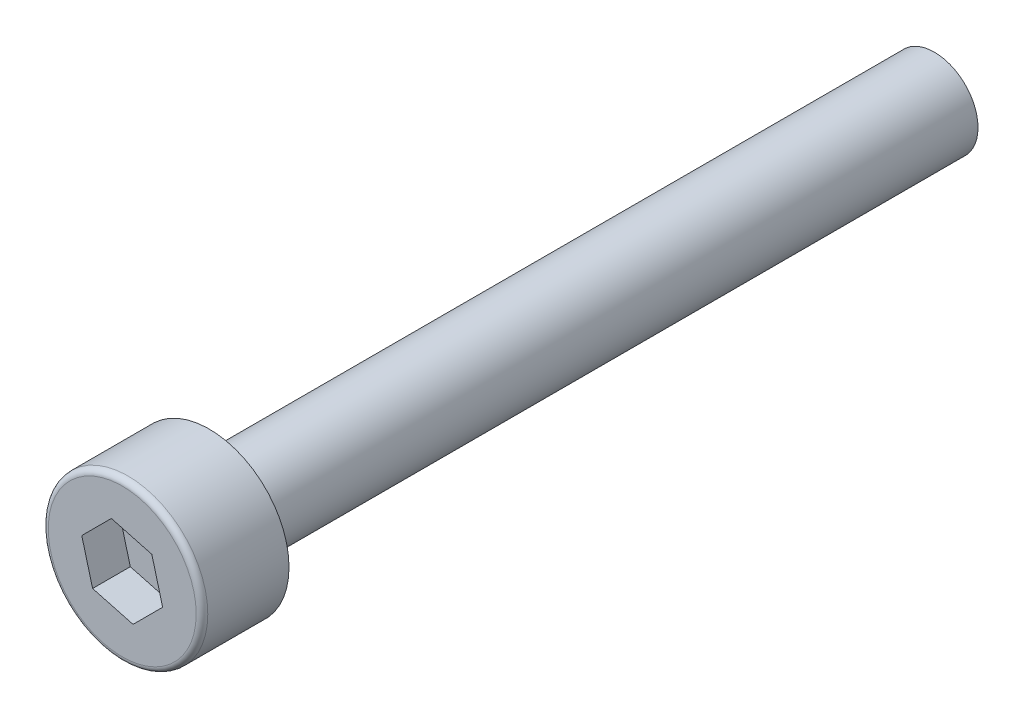
ISO-10303-21;
HEADER;
FILE_DESCRIPTION(('STEP AP214'),'2;1');
FILE_NAME('part.step','',(''),(''),'','','');
FILE_SCHEMA(('AUTOMOTIVE_DESIGN { 1 0 10303 214 1 1 1 1 }'));
ENDSEC;
DATA;
#1=APPLICATION_CONTEXT('core data for automotive mechanical design processes');
#2=APPLICATION_PROTOCOL_DEFINITION('international standard','automotive_design',2000,#1);
#3=PRODUCT_CONTEXT('',#1,'mechanical');
#4=PRODUCT('Part','Part','',(#3));
#5=PRODUCT_RELATED_PRODUCT_CATEGORY('part','',(#4));
#6=PRODUCT_DEFINITION_FORMATION('','',#4);
#7=PRODUCT_DEFINITION_CONTEXT('part definition',#1,'design');
#8=PRODUCT_DEFINITION('design','',#6,#7);
#9=PRODUCT_DEFINITION_SHAPE('','',#8);
#10=(LENGTH_UNIT() NAMED_UNIT(*) SI_UNIT(.MILLI.,.METRE.));
#11=(NAMED_UNIT(*) PLANE_ANGLE_UNIT() SI_UNIT($,.RADIAN.));
#12=(NAMED_UNIT(*) SI_UNIT($,.STERADIAN.) SOLID_ANGLE_UNIT());
#13=UNCERTAINTY_MEASURE_WITH_UNIT(LENGTH_MEASURE(1.E-05),#10,'distance_accuracy_value','');
#14=(GEOMETRIC_REPRESENTATION_CONTEXT(3) GLOBAL_UNCERTAINTY_ASSIGNED_CONTEXT((#13)) GLOBAL_UNIT_ASSIGNED_CONTEXT((#10,
#11,#12)) REPRESENTATION_CONTEXT('',''));
#15=CARTESIAN_POINT('',(0.,0.,0.));
#16=DIRECTION('',(0.,0.,1.));
#17=DIRECTION('',(1.,0.,0.));
#18=AXIS2_PLACEMENT_3D('',#15,#16,#17);
#19=CARTESIAN_POINT('',(0.,0.,0.));
#20=DIRECTION('',(0.,0.,1.));
#21=DIRECTION('',(1.,0.,0.));
#22=AXIS2_PLACEMENT_3D('',#19,#20,#21);
#23=PLANE('',#22);
#24=CARTESIAN_POINT('',(0.,0.,0.));
#25=DIRECTION('',(0.,0.,1.));
#26=DIRECTION('',(1.,0.,0.));
#27=AXIS2_PLACEMENT_3D('',#24,#25,#26);
#28=CIRCLE('',#27,2.75);
#29=CARTESIAN_POINT('',(2.75,0.,0.));
#30=VERTEX_POINT('',#29);
#31=EDGE_CURVE('E137',#30,#30,#28,.T.);
#32=ORIENTED_EDGE('',*,*,#31,.F.);
#33=EDGE_LOOP('',(#32));
#34=FACE_BOUND('',#33,.T.);
#35=CARTESIAN_POINT('',(0.,0.,0.));
#36=DIRECTION('',(0.,0.,1.));
#37=DIRECTION('',(1.,0.,0.));
#38=AXIS2_PLACEMENT_3D('',#35,#36,#37);
#39=CIRCLE('',#38,1.5);
#40=CARTESIAN_POINT('',(1.5,0.,0.));
#41=VERTEX_POINT('',#40);
#42=EDGE_CURVE('E145',#41,#41,#39,.F.);
#43=ORIENTED_EDGE('',*,*,#42,.F.);
#44=EDGE_LOOP('',(#43));
#45=FACE_BOUND('',#44,.T.);
#46=ADVANCED_FACE('F34',(#34,#45),#23,.F.);
#47=CARTESIAN_POINT('',(0.,0.,3.));
#48=DIRECTION('',(0.,0.,-1.));
#49=DIRECTION('',(-1.,0.,0.));
#50=AXIS2_PLACEMENT_3D('',#47,#48,#49);
#51=CYLINDRICAL_SURFACE('',#50,2.75);
#52=CARTESIAN_POINT('',(0.,0.,2.8));
#53=DIRECTION('',(0.,0.,1.));
#54=DIRECTION('',(1.,0.,0.));
#55=AXIS2_PLACEMENT_3D('',#52,#53,#54);
#56=CIRCLE('',#55,2.75);
#57=CARTESIAN_POINT('',(2.75,0.,2.8));
#58=VERTEX_POINT('',#57);
#59=EDGE_CURVE('E11',#58,#58,#56,.F.);
#60=ORIENTED_EDGE('',*,*,#59,.T.);
#61=EDGE_LOOP('',(#60));
#62=FACE_BOUND('',#61,.T.);
#63=ORIENTED_EDGE('',*,*,#31,.T.);
#64=EDGE_LOOP('',(#63));
#65=FACE_BOUND('',#64,.T.);
#66=ADVANCED_FACE('F164',(#62,#65),#51,.T.);
#67=CARTESIAN_POINT('',(0.,0.,3.));
#68=DIRECTION('',(0.,0.,1.));
#69=DIRECTION('',(1.,0.,0.));
#70=AXIS2_PLACEMENT_3D('',#67,#68,#69);
#71=PLANE('',#70);
#72=CARTESIAN_POINT('',(0.,0.,3.));
#73=DIRECTION('',(0.,0.,1.));
#74=DIRECTION('',(1.,0.,0.));
#75=AXIS2_PLACEMENT_3D('',#72,#73,#74);
#76=CIRCLE('',#75,2.55);
#77=CARTESIAN_POINT('',(2.55,0.,3.));
#78=VERTEX_POINT('',#77);
#79=EDGE_CURVE('E42',#78,#78,#76,.T.);
#80=ORIENTED_EDGE('',*,*,#79,.T.);
#81=EDGE_LOOP('',(#80));
#82=FACE_BOUND('',#81,.T.);
#83=DIRECTION('',(0.258819045102521,-0.965925826289068,0.));
#84=VECTOR('',#83,1.);
#85=CARTESIAN_POINT('',(-1.39419383956301,0.373573113403356,3.));
#86=LINE('',#85,#84);
#87=CARTESIAN_POINT('',(-1.39419383956301,0.373573113403356,3.));
#88=VERTEX_POINT('',#87);
#89=CARTESIAN_POINT('',(-1.02062072615966,-1.02062072615966,3.));
#90=VERTEX_POINT('',#89);
#91=EDGE_CURVE('E49',#88,#90,#86,.T.);
#92=ORIENTED_EDGE('',*,*,#91,.F.);
#93=DIRECTION('',(-0.707106781186548,-0.707106781186548,0.));
#94=VECTOR('',#93,1.);
#95=CARTESIAN_POINT('',(-0.373573113403355,1.39419383956301,3.));
#96=LINE('',#95,#94);
#97=CARTESIAN_POINT('',(-0.373573113403355,1.39419383956301,3.));
#98=VERTEX_POINT('',#97);
#99=EDGE_CURVE('E133',#98,#88,#96,.T.);
#100=ORIENTED_EDGE('',*,*,#99,.F.);
#101=DIRECTION('',(-0.965925826289068,0.258819045102521,0.));
#102=VECTOR('',#101,1.);
#103=CARTESIAN_POINT('',(1.02062072615966,1.02062072615966,3.));
#104=LINE('',#103,#102);
#105=CARTESIAN_POINT('',(1.02062072615966,1.02062072615966,3.));
#106=VERTEX_POINT('',#105);
#107=EDGE_CURVE('E131',#106,#98,#104,.T.);
#108=ORIENTED_EDGE('',*,*,#107,.F.);
#109=DIRECTION('',(-0.258819045102521,0.965925826289068,0.));
#110=VECTOR('',#109,1.);
#111=CARTESIAN_POINT('',(1.39419383956301,-0.373573113403355,3.));
#112=LINE('',#111,#110);
#113=CARTESIAN_POINT('',(1.39419383956301,-0.373573113403355,3.));
#114=VERTEX_POINT('',#113);
#115=EDGE_CURVE('E97',#114,#106,#112,.T.);
#116=ORIENTED_EDGE('',*,*,#115,.F.);
#117=DIRECTION('',(0.707106781186548,0.707106781186548,0.));
#118=VECTOR('',#117,1.);
#119=CARTESIAN_POINT('',(0.373573113403355,-1.39419383956301,3.));
#120=LINE('',#119,#118);
#121=CARTESIAN_POINT('',(0.373573113403355,-1.39419383956301,3.));
#122=VERTEX_POINT('',#121);
#123=EDGE_CURVE('E127',#122,#114,#120,.T.);
#124=ORIENTED_EDGE('',*,*,#123,.F.);
#125=DIRECTION('',(0.965925826289068,-0.258819045102521,0.));
#126=VECTOR('',#125,1.);
#127=CARTESIAN_POINT('',(-1.02062072615966,-1.02062072615966,3.));
#128=LINE('',#127,#126);
#129=EDGE_CURVE('E123',#90,#122,#128,.T.);
#130=ORIENTED_EDGE('',*,*,#129,.F.);
#131=EDGE_LOOP('',(#92,#100,#108,#116,#124,#130));
#132=FACE_BOUND('',#131,.T.);
#133=ADVANCED_FACE('F150',(#82,#132),#71,.T.);
#134=CARTESIAN_POINT('',(-1.39419383956301,0.373573113403356,1.7));
#135=DIRECTION('',(-0.965925826289068,-0.258819045102521,0.));
#136=DIRECTION('',(0.258819045102521,-0.965925826289068,0.));
#137=AXIS2_PLACEMENT_3D('',#134,#135,#136);
#138=PLANE('',#137);
#139=ORIENTED_EDGE('',*,*,#91,.T.);
#140=DIRECTION('',(0.,0.,1.));
#141=VECTOR('',#140,1.);
#142=CARTESIAN_POINT('',(-1.02062072615966,-1.02062072615966,1.7));
#143=LINE('',#142,#141);
#144=CARTESIAN_POINT('',(-1.02062072615966,-1.02062072615966,1.7));
#145=VERTEX_POINT('',#144);
#146=EDGE_CURVE('E79',#145,#90,#143,.T.);
#147=ORIENTED_EDGE('',*,*,#146,.F.);
#148=DIRECTION('',(0.258819045102521,-0.965925826289068,0.));
#149=VECTOR('',#148,1.);
#150=CARTESIAN_POINT('',(-1.39419383956301,0.373573113403356,1.7));
#151=LINE('',#150,#149);
#152=CARTESIAN_POINT('',(-1.39419383956301,0.373573113403356,1.7));
#153=VERTEX_POINT('',#152);
#154=EDGE_CURVE('E135',#153,#145,#151,.T.);
#155=ORIENTED_EDGE('',*,*,#154,.F.);
#156=DIRECTION('',(0.,0.,1.));
#157=VECTOR('',#156,1.);
#158=CARTESIAN_POINT('',(-1.39419383956301,0.373573113403356,1.7));
#159=LINE('',#158,#157);
#160=EDGE_CURVE('E57',#153,#88,#159,.T.);
#161=ORIENTED_EDGE('',*,*,#160,.T.);
#162=EDGE_LOOP('',(#139,#147,#155,#161));
#163=FACE_BOUND('',#162,.T.);
#164=ADVANCED_FACE('F176',(#163),#138,.F.);
#165=CARTESIAN_POINT('',(-0.373573113403355,1.39419383956301,1.7));
#166=DIRECTION('',(-0.707106781186548,0.707106781186548,0.));
#167=DIRECTION('',(-0.707106781186548,-0.707106781186548,0.));
#168=AXIS2_PLACEMENT_3D('',#165,#166,#167);
#169=PLANE('',#168);
#170=ORIENTED_EDGE('',*,*,#99,.T.);
#171=ORIENTED_EDGE('',*,*,#160,.F.);
#172=DIRECTION('',(-0.707106781186548,-0.707106781186548,0.));
#173=VECTOR('',#172,1.);
#174=CARTESIAN_POINT('',(-0.373573113403355,1.39419383956301,1.7));
#175=LINE('',#174,#173);
#176=CARTESIAN_POINT('',(-0.373573113403355,1.39419383956301,1.7));
#177=VERTEX_POINT('',#176);
#178=EDGE_CURVE('E109',#177,#153,#175,.T.);
#179=ORIENTED_EDGE('',*,*,#178,.F.);
#180=DIRECTION('',(0.,0.,1.));
#181=VECTOR('',#180,1.);
#182=CARTESIAN_POINT('',(-0.373573113403355,1.39419383956301,1.7));
#183=LINE('',#182,#181);
#184=EDGE_CURVE('E101',#177,#98,#183,.T.);
#185=ORIENTED_EDGE('',*,*,#184,.T.);
#186=EDGE_LOOP('',(#170,#171,#179,#185));
#187=FACE_BOUND('',#186,.T.);
#188=ADVANCED_FACE('F179',(#187),#169,.F.);
#189=CARTESIAN_POINT('',(1.02062072615966,1.02062072615966,1.7));
#190=DIRECTION('',(0.258819045102521,0.965925826289068,0.));
#191=DIRECTION('',(-0.965925826289068,0.258819045102521,0.));
#192=AXIS2_PLACEMENT_3D('',#189,#190,#191);
#193=PLANE('',#192);
#194=ORIENTED_EDGE('',*,*,#107,.T.);
#195=ORIENTED_EDGE('',*,*,#184,.F.);
#196=DIRECTION('',(-0.965925826289068,0.258819045102521,0.));
#197=VECTOR('',#196,1.);
#198=CARTESIAN_POINT('',(1.02062072615966,1.02062072615966,1.7));
#199=LINE('',#198,#197);
#200=CARTESIAN_POINT('',(1.02062072615966,1.02062072615966,1.7));
#201=VERTEX_POINT('',#200);
#202=EDGE_CURVE('E105',#201,#177,#199,.T.);
#203=ORIENTED_EDGE('',*,*,#202,.F.);
#204=DIRECTION('',(0.,0.,1.));
#205=VECTOR('',#204,1.);
#206=CARTESIAN_POINT('',(1.02062072615966,1.02062072615966,1.7));
#207=LINE('',#206,#205);
#208=EDGE_CURVE('E90',#201,#106,#207,.T.);
#209=ORIENTED_EDGE('',*,*,#208,.T.);
#210=EDGE_LOOP('',(#194,#195,#203,#209));
#211=FACE_BOUND('',#210,.T.);
#212=ADVANCED_FACE('F106',(#211),#193,.F.);
#213=CARTESIAN_POINT('',(1.39419383956301,-0.373573113403355,1.7));
#214=DIRECTION('',(0.965925826289068,0.258819045102521,0.));
#215=DIRECTION('',(-0.258819045102521,0.965925826289068,0.));
#216=AXIS2_PLACEMENT_3D('',#213,#214,#215);
#217=PLANE('',#216);
#218=ORIENTED_EDGE('',*,*,#115,.T.);
#219=ORIENTED_EDGE('',*,*,#208,.F.);
#220=DIRECTION('',(-0.258819045102521,0.965925826289068,0.));
#221=VECTOR('',#220,1.);
#222=CARTESIAN_POINT('',(1.39419383956301,-0.373573113403355,1.7));
#223=LINE('',#222,#221);
#224=CARTESIAN_POINT('',(1.39419383956301,-0.373573113403355,1.7));
#225=VERTEX_POINT('',#224);
#226=EDGE_CURVE('E94',#225,#201,#223,.T.);
#227=ORIENTED_EDGE('',*,*,#226,.F.);
#228=DIRECTION('',(0.,0.,1.));
#229=VECTOR('',#228,1.);
#230=CARTESIAN_POINT('',(1.39419383956301,-0.373573113403355,1.7));
#231=LINE('',#230,#229);
#232=EDGE_CURVE('E102',#225,#114,#231,.T.);
#233=ORIENTED_EDGE('',*,*,#232,.T.);
#234=EDGE_LOOP('',(#218,#219,#227,#233));
#235=FACE_BOUND('',#234,.T.);
#236=ADVANCED_FACE('F92',(#235),#217,.F.);
#237=CARTESIAN_POINT('',(0.373573113403355,-1.39419383956301,1.7));
#238=DIRECTION('',(0.707106781186548,-0.707106781186548,0.));
#239=DIRECTION('',(0.707106781186548,0.707106781186548,0.));
#240=AXIS2_PLACEMENT_3D('',#237,#238,#239);
#241=PLANE('',#240);
#242=ORIENTED_EDGE('',*,*,#123,.T.);
#243=ORIENTED_EDGE('',*,*,#232,.F.);
#244=DIRECTION('',(0.707106781186548,0.707106781186548,0.));
#245=VECTOR('',#244,1.);
#246=CARTESIAN_POINT('',(0.373573113403355,-1.39419383956301,1.7));
#247=LINE('',#246,#245);
#248=CARTESIAN_POINT('',(0.373573113403355,-1.39419383956301,1.7));
#249=VERTEX_POINT('',#248);
#250=EDGE_CURVE('E115',#249,#225,#247,.T.);
#251=ORIENTED_EDGE('',*,*,#250,.F.);
#252=DIRECTION('',(0.,0.,1.));
#253=VECTOR('',#252,1.);
#254=CARTESIAN_POINT('',(0.373573113403355,-1.39419383956301,1.7));
#255=LINE('',#254,#253);
#256=EDGE_CURVE('E140',#249,#122,#255,.T.);
#257=ORIENTED_EDGE('',*,*,#256,.T.);
#258=EDGE_LOOP('',(#242,#243,#251,#257));
#259=FACE_BOUND('',#258,.T.);
#260=ADVANCED_FACE('F183',(#259),#241,.F.);
#261=CARTESIAN_POINT('',(-1.02062072615966,-1.02062072615966,1.7));
#262=DIRECTION('',(-0.258819045102521,-0.965925826289068,0.));
#263=DIRECTION('',(0.965925826289068,-0.258819045102521,0.));
#264=AXIS2_PLACEMENT_3D('',#261,#262,#263);
#265=PLANE('',#264);
#266=ORIENTED_EDGE('',*,*,#129,.T.);
#267=ORIENTED_EDGE('',*,*,#256,.F.);
#268=DIRECTION('',(0.965925826289068,-0.258819045102521,0.));
#269=VECTOR('',#268,1.);
#270=CARTESIAN_POINT('',(-1.02062072615966,-1.02062072615966,1.7));
#271=LINE('',#270,#269);
#272=EDGE_CURVE('E117',#145,#249,#271,.T.);
#273=ORIENTED_EDGE('',*,*,#272,.F.);
#274=ORIENTED_EDGE('',*,*,#146,.T.);
#275=EDGE_LOOP('',(#266,#267,#273,#274));
#276=FACE_BOUND('',#275,.T.);
#277=ADVANCED_FACE('F180',(#276),#265,.F.);
#278=CARTESIAN_POINT('',(0.,0.,1.7));
#279=DIRECTION('',(0.,0.,1.));
#280=DIRECTION('',(1.,0.,0.));
#281=AXIS2_PLACEMENT_3D('',#278,#279,#280);
#282=PLANE('',#281);
#283=ORIENTED_EDGE('',*,*,#154,.T.);
#284=ORIENTED_EDGE('',*,*,#272,.T.);
#285=ORIENTED_EDGE('',*,*,#250,.T.);
#286=ORIENTED_EDGE('',*,*,#226,.T.);
#287=ORIENTED_EDGE('',*,*,#202,.T.);
#288=ORIENTED_EDGE('',*,*,#178,.T.);
#289=EDGE_LOOP('',(#283,#284,#285,#286,#287,#288));
#290=FACE_BOUND('',#289,.T.);
#291=ADVANCED_FACE('F112',(#290),#282,.T.);
#292=CARTESIAN_POINT('',(0.,0.,-25.));
#293=DIRECTION('',(0.,0.,1.));
#294=DIRECTION('',(1.,0.,0.));
#295=AXIS2_PLACEMENT_3D('',#292,#293,#294);
#296=CYLINDRICAL_SURFACE('',#295,1.5);
#297=CARTESIAN_POINT('',(0.,0.,-25.));
#298=DIRECTION('',(0.,0.,-1.));
#299=DIRECTION('',(-1.,0.,0.));
#300=AXIS2_PLACEMENT_3D('',#297,#298,#299);
#301=CIRCLE('',#300,1.5);
#302=CARTESIAN_POINT('',(-1.5,0.,-25.));
#303=VERTEX_POINT('',#302);
#304=EDGE_CURVE('E124',#303,#303,#301,.T.);
#305=ORIENTED_EDGE('',*,*,#304,.F.);
#306=EDGE_LOOP('',(#305));
#307=FACE_BOUND('',#306,.T.);
#308=ORIENTED_EDGE('',*,*,#42,.T.);
#309=EDGE_LOOP('',(#308));
#310=FACE_BOUND('',#309,.T.);
#311=ADVANCED_FACE('F159',(#307,#310),#296,.T.);
#312=CARTESIAN_POINT('',(0.,0.,-25.));
#313=DIRECTION('',(0.,0.,-1.));
#314=DIRECTION('',(-1.,0.,0.));
#315=AXIS2_PLACEMENT_3D('',#312,#313,#314);
#316=PLANE('',#315);
#317=ORIENTED_EDGE('',*,*,#304,.T.);
#318=EDGE_LOOP('',(#317));
#319=FACE_BOUND('',#318,.T.);
#320=ADVANCED_FACE('F154',(#319),#316,.T.);
#321=CARTESIAN_POINT('',(0.,0.,2.8));
#322=DIRECTION('',(0.,0.,1.));
#323=DIRECTION('',(1.,0.,0.));
#324=AXIS2_PLACEMENT_3D('',#321,#322,#323);
#325=TOROIDAL_SURFACE('',#324,2.55,0.2);
#326=ORIENTED_EDGE('',*,*,#59,.F.);
#327=EDGE_LOOP('',(#326));
#328=FACE_BOUND('',#327,.T.);
#329=ORIENTED_EDGE('',*,*,#79,.F.);
#330=EDGE_LOOP('',(#329));
#331=FACE_BOUND('',#330,.T.);
#332=ADVANCED_FACE('F36',(#328,#331),#325,.T.);
#333=CLOSED_SHELL('',(#46,#66,#133,#164,#188,#212,#236,#260,#277,#291,#311,#320,#332));
#334=MANIFOLD_SOLID_BREP('B2',#333);
#335=ADVANCED_BREP_SHAPE_REPRESENTATION('',(#18,#334),#14);
#336=SHAPE_DEFINITION_REPRESENTATION(#9,#335);
ENDSEC;
END-ISO-10303-21;
